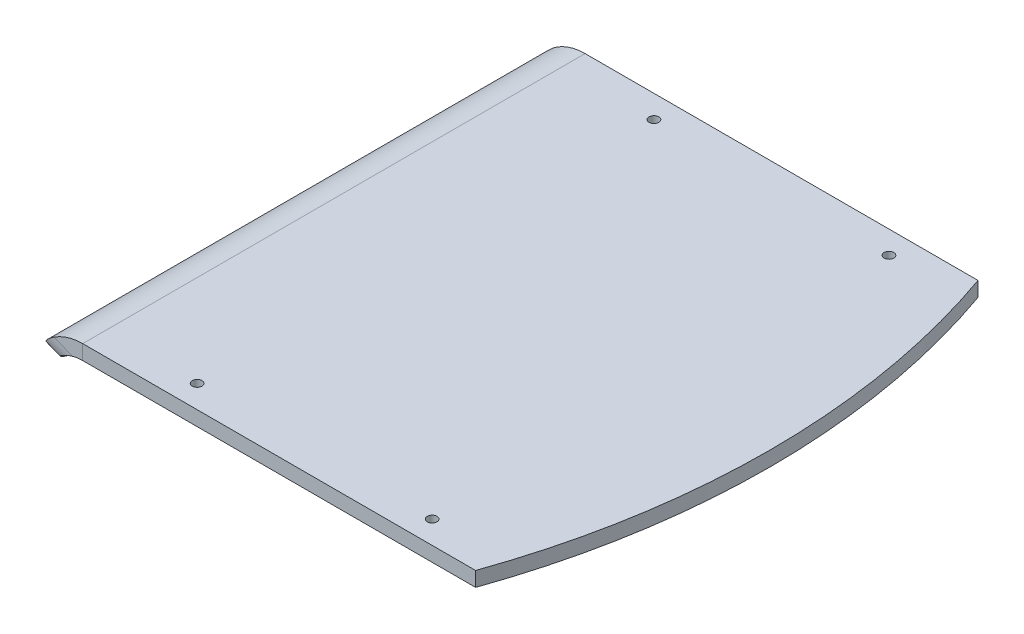
ISO-10303-21;
HEADER;
FILE_DESCRIPTION(('STEP AP214'),'2;1');
FILE_NAME('part.step','',(''),(''),'','','');
FILE_SCHEMA(('AUTOMOTIVE_DESIGN { 1 0 10303 214 1 1 1 1 }'));
ENDSEC;
DATA;
#1=APPLICATION_CONTEXT('core data for automotive mechanical design processes');
#2=APPLICATION_PROTOCOL_DEFINITION('international standard','automotive_design',2000,#1);
#3=PRODUCT_CONTEXT('',#1,'mechanical');
#4=PRODUCT('Part','Part','',(#3));
#5=PRODUCT_RELATED_PRODUCT_CATEGORY('part','',(#4));
#6=PRODUCT_DEFINITION_FORMATION('','',#4);
#7=PRODUCT_DEFINITION_CONTEXT('part definition',#1,'design');
#8=PRODUCT_DEFINITION('design','',#6,#7);
#9=PRODUCT_DEFINITION_SHAPE('','',#8);
#10=(LENGTH_UNIT() NAMED_UNIT(*) SI_UNIT(.MILLI.,.METRE.));
#11=(NAMED_UNIT(*) PLANE_ANGLE_UNIT() SI_UNIT($,.RADIAN.));
#12=(NAMED_UNIT(*) SI_UNIT($,.STERADIAN.) SOLID_ANGLE_UNIT());
#13=UNCERTAINTY_MEASURE_WITH_UNIT(LENGTH_MEASURE(1.E-05),#10,'distance_accuracy_value','');
#14=(GEOMETRIC_REPRESENTATION_CONTEXT(3) GLOBAL_UNCERTAINTY_ASSIGNED_CONTEXT((#13)) GLOBAL_UNIT_ASSIGNED_CONTEXT((#10,
#11,#12)) REPRESENTATION_CONTEXT('',''));
#15=CARTESIAN_POINT('',(0.,0.,0.));
#16=DIRECTION('',(0.,0.,1.));
#17=DIRECTION('',(1.,0.,0.));
#18=AXIS2_PLACEMENT_3D('',#15,#16,#17);
#19=CARTESIAN_POINT('',(150.,0.,171.));
#20=DIRECTION('',(0.,-1.,0.));
#21=DIRECTION('',(1.,0.,0.));
#22=AXIS2_PLACEMENT_3D('',#19,#20,#21);
#23=PLANE('',#22);
#24=CARTESIAN_POINT('',(75.6704769682475,0.,-155.5));
#25=DIRECTION('',(0.,-1.,0.));
#26=DIRECTION('',(1.,0.,0.));
#27=AXIS2_PLACEMENT_3D('',#24,#25,#26);
#28=CIRCLE('',#27,3.29999999999999);
#29=CARTESIAN_POINT('',(78.9704769682475,0.,-155.5));
#30=VERTEX_POINT('',#29);
#31=EDGE_CURVE('E251',#30,#30,#28,.T.);
#32=ORIENTED_EDGE('',*,*,#31,.F.);
#33=EDGE_LOOP('',(#32));
#34=FACE_BOUND('',#33,.T.);
#35=CARTESIAN_POINT('',(-84.3295230317525,0.,-155.5));
#36=DIRECTION('',(0.,-1.,0.));
#37=DIRECTION('',(1.,0.,0.));
#38=AXIS2_PLACEMENT_3D('',#35,#36,#37);
#39=CIRCLE('',#38,3.29999999999999);
#40=CARTESIAN_POINT('',(-81.0295230317525,0.,-155.5));
#41=VERTEX_POINT('',#40);
#42=EDGE_CURVE('E261',#41,#41,#39,.T.);
#43=ORIENTED_EDGE('',*,*,#42,.F.);
#44=EDGE_LOOP('',(#43));
#45=FACE_BOUND('',#44,.T.);
#46=CARTESIAN_POINT('',(-84.3295230317525,0.,155.5));
#47=DIRECTION('',(0.,-1.,0.));
#48=DIRECTION('',(1.,0.,0.));
#49=AXIS2_PLACEMENT_3D('',#46,#47,#48);
#50=CIRCLE('',#49,3.3);
#51=CARTESIAN_POINT('',(-81.0295230317525,0.,155.5));
#52=VERTEX_POINT('',#51);
#53=EDGE_CURVE('E267',#52,#52,#50,.T.);
#54=ORIENTED_EDGE('',*,*,#53,.F.);
#55=EDGE_LOOP('',(#54));
#56=FACE_BOUND('',#55,.T.);
#57=CARTESIAN_POINT('',(75.6704769682475,0.,155.5));
#58=DIRECTION('',(0.,-1.,0.));
#59=DIRECTION('',(1.,0.,0.));
#60=AXIS2_PLACEMENT_3D('',#57,#58,#59);
#61=CIRCLE('',#60,3.3);
#62=CARTESIAN_POINT('',(78.9704769682475,0.,155.5));
#63=VERTEX_POINT('',#62);
#64=EDGE_CURVE('E127',#63,#63,#61,.T.);
#65=ORIENTED_EDGE('',*,*,#64,.F.);
#66=EDGE_LOOP('',(#65));
#67=FACE_BOUND('',#66,.T.);
#68=CARTESIAN_POINT('',(-365.,0.,0.));
#69=DIRECTION('',(0.,-1.,0.));
#70=DIRECTION('',(1.,0.,0.));
#71=AXIS2_PLACEMENT_3D('',#68,#69,#70);
#72=CIRCLE('',#71,515.);
#73=CARTESIAN_POINT('',(120.781844041129,0.,-171.));
#74=VERTEX_POINT('',#73);
#75=CARTESIAN_POINT('',(120.781844041129,0.,171.));
#76=VERTEX_POINT('',#75);
#77=EDGE_CURVE('E110',#74,#76,#72,.T.);
#78=ORIENTED_EDGE('',*,*,#77,.T.);
#79=DIRECTION('',(-1.,0.,0.));
#80=VECTOR('',#79,1.);
#81=CARTESIAN_POINT('',(150.,0.,171.));
#82=LINE('',#81,#80);
#83=CARTESIAN_POINT('',(-146.676192420619,0.,171.));
#84=VERTEX_POINT('',#83);
#85=EDGE_CURVE('E114',#76,#84,#82,.T.);
#86=ORIENTED_EDGE('',*,*,#85,.T.);
#87=DIRECTION('',(0.,0.,-1.));
#88=VECTOR('',#87,1.);
#89=CARTESIAN_POINT('',(-146.676192420619,0.,171.));
#90=LINE('',#89,#88);
#91=CARTESIAN_POINT('',(-146.676192420619,0.,-171.));
#92=VERTEX_POINT('',#91);
#93=EDGE_CURVE('E153',#84,#92,#90,.T.);
#94=ORIENTED_EDGE('',*,*,#93,.T.);
#95=DIRECTION('',(-1.,0.,0.));
#96=VECTOR('',#95,1.);
#97=CARTESIAN_POINT('',(150.,0.,-171.));
#98=LINE('',#97,#96);
#99=EDGE_CURVE('E116',#74,#92,#98,.T.);
#100=ORIENTED_EDGE('',*,*,#99,.F.);
#101=EDGE_LOOP('',(#78,#86,#94,#100));
#102=FACE_BOUND('',#101,.T.);
#103=ADVANCED_FACE('F41',(#34,#45,#56,#67,#102),#23,.T.);
#104=CARTESIAN_POINT('',(150.,10.,171.));
#105=DIRECTION('',(0.,-1.,0.));
#106=DIRECTION('',(1.,0.,0.));
#107=AXIS2_PLACEMENT_3D('',#104,#105,#106);
#108=PLANE('',#107);
#109=CARTESIAN_POINT('',(75.6704769682475,9.99999999999999,-155.5));
#110=DIRECTION('',(0.,1.,0.));
#111=DIRECTION('',(1.,0.,0.));
#112=AXIS2_PLACEMENT_3D('',#109,#110,#111);
#113=CIRCLE('',#112,3.29999999999999);
#114=CARTESIAN_POINT('',(78.9704769682475,9.99999999999999,-155.5));
#115=VERTEX_POINT('',#114);
#116=EDGE_CURVE('E254',#115,#115,#113,.T.);
#117=ORIENTED_EDGE('',*,*,#116,.F.);
#118=EDGE_LOOP('',(#117));
#119=FACE_BOUND('',#118,.T.);
#120=CARTESIAN_POINT('',(-84.3295230317525,9.99999999999997,-155.5));
#121=DIRECTION('',(0.,1.,0.));
#122=DIRECTION('',(1.,0.,0.));
#123=AXIS2_PLACEMENT_3D('',#120,#121,#122);
#124=CIRCLE('',#123,3.29999999999999);
#125=CARTESIAN_POINT('',(-81.0295230317525,9.99999999999997,-155.5));
#126=VERTEX_POINT('',#125);
#127=EDGE_CURVE('E256',#126,#126,#124,.T.);
#128=ORIENTED_EDGE('',*,*,#127,.F.);
#129=EDGE_LOOP('',(#128));
#130=FACE_BOUND('',#129,.T.);
#131=CARTESIAN_POINT('',(-84.3295230317525,9.99999999999997,155.5));
#132=DIRECTION('',(0.,1.,0.));
#133=DIRECTION('',(-1.,0.,0.));
#134=AXIS2_PLACEMENT_3D('',#131,#132,#133);
#135=CIRCLE('',#134,3.3);
#136=CARTESIAN_POINT('',(-87.6295230317525,9.99999999999997,155.5));
#137=VERTEX_POINT('',#136);
#138=EDGE_CURVE('E264',#137,#137,#135,.T.);
#139=ORIENTED_EDGE('',*,*,#138,.F.);
#140=EDGE_LOOP('',(#139));
#141=FACE_BOUND('',#140,.T.);
#142=CARTESIAN_POINT('',(75.6704769682475,9.99999999999999,155.5));
#143=DIRECTION('',(0.,1.,0.));
#144=DIRECTION('',(-1.,0.,0.));
#145=AXIS2_PLACEMENT_3D('',#142,#143,#144);
#146=CIRCLE('',#145,3.3);
#147=CARTESIAN_POINT('',(72.3704769682475,9.99999999999999,155.5));
#148=VERTEX_POINT('',#147);
#149=EDGE_CURVE('E270',#148,#148,#146,.T.);
#150=ORIENTED_EDGE('',*,*,#149,.F.);
#151=EDGE_LOOP('',(#150));
#152=FACE_BOUND('',#151,.T.);
#153=DIRECTION('',(-1.,0.,0.));
#154=VECTOR('',#153,1.);
#155=CARTESIAN_POINT('',(150.,10.,171.));
#156=LINE('',#155,#154);
#157=CARTESIAN_POINT('',(120.781844041129,10.,171.));
#158=VERTEX_POINT('',#157);
#159=CARTESIAN_POINT('',(-146.676192420619,9.99999999999997,171.));
#160=VERTEX_POINT('',#159);
#161=EDGE_CURVE('E133',#158,#160,#156,.T.);
#162=ORIENTED_EDGE('',*,*,#161,.F.);
#163=CARTESIAN_POINT('',(-365.,9.99999999999994,0.));
#164=DIRECTION('',(0.,-1.,0.));
#165=DIRECTION('',(1.,0.,0.));
#166=AXIS2_PLACEMENT_3D('',#163,#164,#165);
#167=CIRCLE('',#166,515.);
#168=CARTESIAN_POINT('',(120.781844041129,10.,-171.));
#169=VERTEX_POINT('',#168);
#170=EDGE_CURVE('E119',#169,#158,#167,.T.);
#171=ORIENTED_EDGE('',*,*,#170,.F.);
#172=DIRECTION('',(-1.,0.,0.));
#173=VECTOR('',#172,1.);
#174=CARTESIAN_POINT('',(150.,10.,-171.));
#175=LINE('',#174,#173);
#176=CARTESIAN_POINT('',(-146.676192420619,9.99999999999997,-171.));
#177=VERTEX_POINT('',#176);
#178=EDGE_CURVE('E149',#169,#177,#175,.T.);
#179=ORIENTED_EDGE('',*,*,#178,.T.);
#180=DIRECTION('',(0.,0.,-1.));
#181=VECTOR('',#180,1.);
#182=CARTESIAN_POINT('',(-146.676192420619,9.99999999999997,171.));
#183=LINE('',#182,#181);
#184=EDGE_CURVE('E136',#160,#177,#183,.T.);
#185=ORIENTED_EDGE('',*,*,#184,.F.);
#186=EDGE_LOOP('',(#162,#171,#179,#185));
#187=FACE_BOUND('',#186,.T.);
#188=ADVANCED_FACE('F219',(#119,#130,#141,#152,#187),#108,.F.);
#189=CARTESIAN_POINT('',(-146.676192420619,-25.,171.));
#190=DIRECTION('',(0.,0.,1.));
#191=DIRECTION('',(1.,0.,0.));
#192=AXIS2_PLACEMENT_3D('',#189,#190,#191);
#193=PLANE('',#192);
#194=ORIENTED_EDGE('',*,*,#85,.F.);
#195=DIRECTION('',(0.,-1.,0.));
#196=VECTOR('',#195,1.);
#197=CARTESIAN_POINT('',(120.781844041129,0.,171.));
#198=LINE('',#197,#196);
#199=EDGE_CURVE('E120',#76,#158,#198,.F.);
#200=ORIENTED_EDGE('',*,*,#199,.T.);
#201=ORIENTED_EDGE('',*,*,#161,.T.);
#202=DIRECTION('',(0.,-1.,0.));
#203=VECTOR('',#202,1.);
#204=CARTESIAN_POINT('',(-146.676192420619,9.99999999999997,171.));
#205=LINE('',#204,#203);
#206=EDGE_CURVE('E131',#160,#84,#205,.T.);
#207=ORIENTED_EDGE('',*,*,#206,.T.);
#208=EDGE_LOOP('',(#194,#200,#201,#207));
#209=FACE_BOUND('',#208,.T.);
#210=ADVANCED_FACE('F129',(#209),#193,.T.);
#211=CARTESIAN_POINT('',(-146.676192420619,-25.,-171.));
#212=DIRECTION('',(0.,0.,1.));
#213=DIRECTION('',(1.,0.,0.));
#214=AXIS2_PLACEMENT_3D('',#211,#212,#213);
#215=PLANE('',#214);
#216=DIRECTION('',(0.,-1.,0.));
#217=VECTOR('',#216,1.);
#218=CARTESIAN_POINT('',(120.781844041129,0.,-171.));
#219=LINE('',#218,#217);
#220=EDGE_CURVE('E146',#74,#169,#219,.F.);
#221=ORIENTED_EDGE('',*,*,#220,.F.);
#222=ORIENTED_EDGE('',*,*,#99,.T.);
#223=DIRECTION('',(0.,1.,0.));
#224=VECTOR('',#223,1.);
#225=CARTESIAN_POINT('',(-146.676192420619,0.,-171.));
#226=LINE('',#225,#224);
#227=EDGE_CURVE('E160',#92,#177,#226,.T.);
#228=ORIENTED_EDGE('',*,*,#227,.T.);
#229=ORIENTED_EDGE('',*,*,#178,.F.);
#230=EDGE_LOOP('',(#221,#222,#228,#229));
#231=FACE_BOUND('',#230,.T.);
#232=ADVANCED_FACE('F197',(#231),#215,.F.);
#233=CARTESIAN_POINT('',(-146.676192420619,9.99999999999997,171.));
#234=DIRECTION('',(0.,0.,1.));
#235=DIRECTION('',(1.,0.,0.));
#236=AXIS2_PLACEMENT_3D('',#233,#234,#235);
#237=PLANE('',#236);
#238=CARTESIAN_POINT('',(-146.676192420619,-25.,171.));
#239=DIRECTION('',(0.,0.,1.));
#240=DIRECTION('',(1.,0.,0.));
#241=AXIS2_PLACEMENT_3D('',#238,#239,#240);
#242=CIRCLE('',#241,35.);
#243=CARTESIAN_POINT('',(-166.27320717973,3.99925882727339,171.));
#244=VERTEX_POINT('',#243);
#245=EDGE_CURVE('E138',#160,#244,#242,.T.);
#246=ORIENTED_EDGE('',*,*,#245,.T.);
#247=DIRECTION('',(-0.932952303175248,0.36,0.));
#248=VECTOR('',#247,1.);
#249=CARTESIAN_POINT('',(-151.231391440627,-1.80495393649508,171.));
#250=LINE('',#249,#248);
#251=CARTESIAN_POINT('',(-153.470476968248,-0.940953936495067,171.));
#252=VERTEX_POINT('',#251);
#253=EDGE_CURVE('E65',#244,#252,#250,.F.);
#254=ORIENTED_EDGE('',*,*,#253,.T.);
#255=CARTESIAN_POINT('',(-146.676192420619,-25.,171.));
#256=DIRECTION('',(0.,0.,1.));
#257=DIRECTION('',(1.,0.,0.));
#258=AXIS2_PLACEMENT_3D('',#255,#256,#257);
#259=CIRCLE('',#258,25.);
#260=EDGE_CURVE('E134',#84,#252,#259,.T.);
#261=ORIENTED_EDGE('',*,*,#260,.F.);
#262=ORIENTED_EDGE('',*,*,#206,.F.);
#263=EDGE_LOOP('',(#246,#254,#261,#262));
#264=FACE_BOUND('',#263,.T.);
#265=ADVANCED_FACE('F194',(#264),#237,.T.);
#266=CARTESIAN_POINT('',(-146.676192420619,0.,-171.));
#267=DIRECTION('',(0.,0.,-1.));
#268=DIRECTION('',(-1.,0.,0.));
#269=AXIS2_PLACEMENT_3D('',#266,#267,#268);
#270=PLANE('',#269);
#271=CARTESIAN_POINT('',(-146.676192420619,-25.,-171.));
#272=DIRECTION('',(0.,0.,1.));
#273=DIRECTION('',(1.,0.,0.));
#274=AXIS2_PLACEMENT_3D('',#271,#272,#273);
#275=CIRCLE('',#274,25.);
#276=CARTESIAN_POINT('',(-153.470476968248,-0.940953936495074,-171.));
#277=VERTEX_POINT('',#276);
#278=EDGE_CURVE('E145',#92,#277,#275,.T.);
#279=ORIENTED_EDGE('',*,*,#278,.T.);
#280=DIRECTION('',(-0.932952303175248,0.36,0.));
#281=VECTOR('',#280,1.);
#282=CARTESIAN_POINT('',(-147.872763149196,-3.10095393649508,-171.));
#283=LINE('',#282,#281);
#284=CARTESIAN_POINT('',(-166.27320717973,3.99925882727339,-171.));
#285=VERTEX_POINT('',#284);
#286=EDGE_CURVE('E12',#277,#285,#283,.T.);
#287=ORIENTED_EDGE('',*,*,#286,.T.);
#288=CARTESIAN_POINT('',(-146.676192420619,-25.,-171.));
#289=DIRECTION('',(0.,0.,1.));
#290=DIRECTION('',(1.,0.,0.));
#291=AXIS2_PLACEMENT_3D('',#288,#289,#290);
#292=CIRCLE('',#291,35.);
#293=EDGE_CURVE('E142',#177,#285,#292,.T.);
#294=ORIENTED_EDGE('',*,*,#293,.F.);
#295=ORIENTED_EDGE('',*,*,#227,.F.);
#296=EDGE_LOOP('',(#279,#287,#294,#295));
#297=FACE_BOUND('',#296,.T.);
#298=ADVANCED_FACE('F188',(#297),#270,.T.);
#299=CARTESIAN_POINT('',(-146.676192420619,-25.,171.));
#300=DIRECTION('',(0.,0.,-1.));
#301=DIRECTION('',(-1.,0.,0.));
#302=AXIS2_PLACEMENT_3D('',#299,#300,#301);
#303=CYLINDRICAL_SURFACE('',#302,35.);
#304=DIRECTION('',(0.,0.,-1.));
#305=VECTOR('',#304,1.);
#306=CARTESIAN_POINT('',(-179.329523031752,-12.4,171.));
#307=LINE('',#306,#305);
#308=CARTESIAN_POINT('',(-179.329523031752,-12.4,151.));
#309=VERTEX_POINT('',#308);
#310=CARTESIAN_POINT('',(-179.329523031752,-12.4,-151.));
#311=VERTEX_POINT('',#310);
#312=EDGE_CURVE('E157',#309,#311,#307,.T.);
#313=ORIENTED_EDGE('',*,*,#312,.F.);
#314=CARTESIAN_POINT('',(-179.329523031752,-12.4,151.));
#315=CARTESIAN_POINT('',(-179.32951869244,-12.4000020436537,151.280369808715));
#316=CARTESIAN_POINT('',(-179.327400926701,-12.3944988807085,151.56070865238));
#317=CARTESIAN_POINT('',(-179.318906284821,-12.3725127607563,152.120883935752));
#318=CARTESIAN_POINT('',(-179.312529512865,-12.3560300723359,152.400720387579));
#319=CARTESIAN_POINT('',(-179.286966293195,-12.2901689162072,153.238700231588));
#320=CARTESIAN_POINT('',(-179.261346970476,-12.2243773276892,153.795450848931));
#321=CARTESIAN_POINT('',(-179.192352661728,-12.0497832789324,154.900962671612));
#322=CARTESIAN_POINT('',(-179.148980472292,-11.9409875931814,155.449725121225));
#323=CARTESIAN_POINT('',(-179.069880491235,-11.7465560863308,156.263875147102));
#324=CARTESIAN_POINT('',(-179.041172172018,-11.6765359561089,156.533769768635));
#325=CARTESIAN_POINT('',(-178.978902833843,-11.5262655190938,157.070207546495));
#326=CARTESIAN_POINT('',(-178.945340530228,-11.4460125047294,157.33674979522));
#327=CARTESIAN_POINT('',(-178.837089129756,-11.1901782859639,158.130788257089));
#328=CARTESIAN_POINT('',(-178.754852983918,-10.9995656287208,158.652513665146));
#329=CARTESIAN_POINT('',(-178.568697630136,-10.580547852359,159.676559438595));
#330=CARTESIAN_POINT('',(-178.464778864271,-10.3521435037793,160.178880199373));
#331=CARTESIAN_POINT('',(-178.291338131235,-9.98331025520624,160.914951252148));
#332=CARTESIAN_POINT('',(-178.230588642447,-9.85597691530751,161.157436219876));
#333=CARTESIAN_POINT('',(-178.103013054542,-9.59297853026256,161.636122853834));
#334=CARTESIAN_POINT('',(-178.036188502992,-9.45731560984503,161.872326100568));
#335=CARTESIAN_POINT('',(-177.826215585233,-9.038368641247,162.570963975943));
#336=CARTESIAN_POINT('',(-177.673553462976,-8.74309511023661,163.02348898082));
#337=CARTESIAN_POINT('',(-177.343351341326,-8.12856353861602,163.892504502915));
#338=CARTESIAN_POINT('',(-177.16616812356,-7.80967551447046,164.309393319873));
#339=CARTESIAN_POINT('',(-176.783866849392,-7.14856655981326,165.110648942881));
#340=CARTESIAN_POINT('',(-176.578748967348,-6.80634577494399,165.495015951897));
#341=CARTESIAN_POINT('',(-176.139603556273,-6.10346844225158,166.227940622912));
#342=CARTESIAN_POINT('',(-175.90560483614,-5.74283047297241,166.576533344277));
#343=CARTESIAN_POINT('',(-175.407831479667,-5.00775536586026,167.235844086764));
#344=CARTESIAN_POINT('',(-175.144058596672,-4.63331904146052,167.546564335887));
#345=CARTESIAN_POINT('',(-174.601294200762,-3.8958023117067,168.112913241007));
#346=CARTESIAN_POINT('',(-174.323831092861,-3.53315932691876,168.370579039491));
#347=CARTESIAN_POINT('',(-173.74255271305,-2.8047482209068,168.849128068974));
#348=CARTESIAN_POINT('',(-173.438738033707,-2.43898017012265,169.070012126756));
#349=CARTESIAN_POINT('',(-172.805301238202,-1.70828935463149,169.47486886553));
#350=CARTESIAN_POINT('',(-172.475642056149,-1.34336860637391,169.658787132863));
#351=CARTESIAN_POINT('',(-171.792427012406,-0.6192178530618,169.989559454259));
#352=CARTESIAN_POINT('',(-171.438872352169,-0.259987563013157,170.136415370045));
#353=CARTESIAN_POINT('',(-170.711558440014,0.447144462933259,170.393357706261));
#354=CARTESIAN_POINT('',(-170.337908332545,0.795093626637897,170.503623235437));
#355=CARTESIAN_POINT('',(-169.570865536777,1.47825178670368,170.689893312308));
#356=CARTESIAN_POINT('',(-169.177468771967,1.81345812712171,170.765890753085));
#357=CARTESIAN_POINT('',(-168.374048817934,2.46763126574353,170.885425564772));
#358=CARTESIAN_POINT('',(-167.964062423522,2.78663080588718,170.929031020612));
#359=CARTESIAN_POINT('',(-167.337935430314,3.25172611100865,170.971994813317));
#360=CARTESIAN_POINT('',(-167.127414735605,3.40449264646199,170.982575480827));
#361=CARTESIAN_POINT('',(-166.702878724278,3.70539190832186,170.996577544341));
#362=CARTESIAN_POINT('',(-166.488863711114,3.8535250338813,170.99999955872));
#363=CARTESIAN_POINT('',(-166.27320717973,3.99925882727338,171.));
#364=B_SPLINE_CURVE_WITH_KNOTS('',3,(#314,#315,#316,#317,#318,#319,#320,#321,#322,#323,#324,
#325,#326,#327,#328,#329,#330,#331,#332,#333,#334,#335,#336,#337,#338,#339,#340,#341,#342,#343,
#344,#345,#346,#347,#348,#349,#350,#351,#352,#353,#354,#355,#356,#357,#358,#359,#360,#361,#362,
#363),.UNSPECIFIED.,.F.,.F.,(4,2,2,2,2,2,2,2,2,2,2,2,2,2,2,2,2,2,2,2,2,2,2,2,4),(0.,
0.840985613107881,1.68195065437118,3.36347185175469,5.04472826256047,5.8854212241463,
6.7263370923848,8.40873246986899,10.091093549038,10.9324874125462,11.7736675359072,
13.4558150533514,15.1156538775732,16.7754823420812,18.433668294762,20.0917566508425,
21.6627025585931,23.2336131497092,24.8068194541431,26.3799467172812,27.9452559020689,
29.5108895698512,31.073223037175,31.8540559339518,32.6348213782575),.UNSPECIFIED.);
#365=EDGE_CURVE('E176',#309,#244,#364,.T.);
#366=ORIENTED_EDGE('',*,*,#365,.T.);
#367=ORIENTED_EDGE('',*,*,#245,.F.);
#368=ORIENTED_EDGE('',*,*,#184,.T.);
#369=ORIENTED_EDGE('',*,*,#293,.T.);
#370=CARTESIAN_POINT('',(-166.27320717973,3.99925882727337,-171.));
#371=CARTESIAN_POINT('',(-166.502988858552,3.84398011202565,-170.999999416559));
#372=CARTESIAN_POINT('',(-166.730905905343,3.68597747730789,-170.996114422901));
#373=CARTESIAN_POINT('',(-167.182756288089,3.36472610782587,-170.980195034698));
#374=CARTESIAN_POINT('',(-167.406689206366,3.20147682800168,-170.968159790822));
#375=CARTESIAN_POINT('',(-168.072289027046,2.70403900246979,-170.919241922258));
#376=CARTESIAN_POINT('',(-168.507517767454,2.36232219131102,-170.869546366828));
#377=CARTESIAN_POINT('',(-169.358779749725,1.66092817290793,-170.733128188115));
#378=CARTESIAN_POINT('',(-169.774770360237,1.30121444050135,-170.646327324391));
#379=CARTESIAN_POINT('',(-170.583817718648,0.568013982951968,-170.433422762388));
#380=CARTESIAN_POINT('',(-170.976880420234,0.194530874781527,-170.307329321627));
#381=CARTESIAN_POINT('',(-171.739557422882,-0.5639931145575,-170.013446971183));
#382=CARTESIAN_POINT('',(-172.109045040831,-0.949082337281606,-169.84545330589));
#383=CARTESIAN_POINT('',(-172.820283603864,-1.72419299365009,-169.467186087466));
#384=CARTESIAN_POINT('',(-173.162032091388,-2.11421486077396,-169.256908793925));
#385=CARTESIAN_POINT('',(-173.815493796142,-2.89307185625862,-168.79452561891));
#386=CARTESIAN_POINT('',(-174.127264391368,-3.28190781442978,-168.542502264314));
#387=CARTESIAN_POINT('',(-174.720563800312,-4.05363663583609,-167.997203337866));
#388=CARTESIAN_POINT('',(-175.002094934095,-4.43652995307791,-167.703930934761));
#389=CARTESIAN_POINT('',(-175.514878438797,-5.16283912759188,-167.101084037074));
#390=CARTESIAN_POINT('',(-175.748312869798,-5.50707328784922,-166.794343618923));
#391=CARTESIAN_POINT('',(-176.189416304035,-6.18160424169637,-166.148740648587));
#392=CARTESIAN_POINT('',(-176.397086521795,-6.51190169177764,-165.809879611897));
#393=CARTESIAN_POINT('',(-176.787551156247,-7.15489695438989,-165.10195206277));
#394=CARTESIAN_POINT('',(-176.970328052417,-7.46758228123563,-164.732864565805));
#395=CARTESIAN_POINT('',(-177.31192202557,-8.07154828340603,-163.967121947117));
#396=CARTESIAN_POINT('',(-177.470738368981,-8.36282830324869,-163.570465981904));
#397=CARTESIAN_POINT('',(-177.768056466827,-8.92521234969637,-162.745710481692));
#398=CARTESIAN_POINT('',(-177.906195092182,-9.19592196648304,-162.317211289783));
#399=CARTESIAN_POINT('',(-178.160578300296,-9.70897442134124,-161.437354208368));
#400=CARTESIAN_POINT('',(-178.27682280769,-9.95131716176653,-160.985996240184));
#401=CARTESIAN_POINT('',(-178.488947345519,-10.4050905578868,-160.063331366091));
#402=CARTESIAN_POINT('',(-178.584824241537,-10.6165164541636,-159.592021403092));
#403=CARTESIAN_POINT('',(-178.757651929534,-11.0062354120001,-158.632459057027));
#404=CARTESIAN_POINT('',(-178.83460191733,-11.1845270656435,-158.144205955071));
#405=CARTESIAN_POINT('',(-178.939358357206,-11.431769232289,-157.382883761487));
#406=CARTESIAN_POINT('',(-178.973441907764,-11.5131732521121,-157.114643380726));
#407=CARTESIAN_POINT('',(-179.036676216058,-11.6656126298674,-156.57472751987));
#408=CARTESIAN_POINT('',(-179.065828125951,-11.7366504090808,-156.303052858094));
#409=CARTESIAN_POINT('',(-179.146150277662,-11.9339295504219,-155.483436256186));
#410=CARTESIAN_POINT('',(-179.190188918965,-12.0443414505104,-154.930887144463));
#411=CARTESIAN_POINT('',(-179.260268434532,-12.2216158195357,-153.817265289338));
#412=CARTESIAN_POINT('',(-179.286294851424,-12.2884433033057,-153.256186067565));
#413=CARTESIAN_POINT('',(-179.312262307432,-12.3553397945878,-152.411662795637));
#414=CARTESIAN_POINT('',(-179.318739425509,-12.3720811751213,-152.129644633648));
#415=CARTESIAN_POINT('',(-179.327367596153,-12.3944124529012,-151.565094892517));
#416=CARTESIAN_POINT('',(-179.329518554156,-12.4000021063867,-151.282563302287));
#417=CARTESIAN_POINT('',(-179.329523031752,-12.4,-151.));
#418=B_SPLINE_CURVE_WITH_KNOTS('',3,(#370,#371,#372,#373,#374,#375,#376,#377,#378,#379,#380,
#381,#382,#383,#384,#385,#386,#387,#388,#389,#390,#391,#392,#393,#394,#395,#396,#397,#398,#399,
#400,#401,#402,#403,#404,#405,#406,#407,#408,#409,#410,#411,#412,#413,#414,#415,#416,#417),
.UNSPECIFIED.,.F.,.F.,(4,2,2,2,2,2,2,2,2,2,2,2,2,2,2,2,2,2,2,2,2,2,2,4),(0.,0.831892906768225,
1.66387251781485,3.32869573056287,4.99704684953681,6.66496280167206,8.34119484703247,
10.0175752371821,11.6906803355784,13.3636569763491,14.9122246616339,16.4607193197145,
18.0102982749708,19.559924662305,21.134188689195,22.7084581349549,24.2829696732361,
25.8575480992361,26.704477633624,27.5512090298024,29.244625675799,30.9393999580739,
31.7869445698063,32.6345077074553),.UNSPECIFIED.);
#419=EDGE_CURVE('E169',#285,#311,#418,.T.);
#420=ORIENTED_EDGE('',*,*,#419,.T.);
#421=EDGE_LOOP('',(#313,#366,#367,#368,#369,#420));
#422=FACE_BOUND('',#421,.T.);
#423=ADVANCED_FACE('F182',(#422),#303,.T.);
#424=CARTESIAN_POINT('',(-170.,-16.,171.));
#425=DIRECTION('',(-0.36,-0.932952303175248,0.));
#426=DIRECTION('',(0.932952303175248,-0.36,0.));
#427=AXIS2_PLACEMENT_3D('',#424,#425,#426);
#428=PLANE('',#427);
#429=DIRECTION('',(0.,0.,-1.));
#430=VECTOR('',#429,1.);
#431=CARTESIAN_POINT('',(-170.,-16.,171.));
#432=LINE('',#431,#430);
#433=CARTESIAN_POINT('',(-170.,-16.,151.));
#434=VERTEX_POINT('',#433);
#435=CARTESIAN_POINT('',(-170.,-16.,-151.));
#436=VERTEX_POINT('',#435);
#437=EDGE_CURVE('E155',#434,#436,#432,.T.);
#438=ORIENTED_EDGE('',*,*,#437,.F.);
#439=DIRECTION('',(-0.932952303175248,0.36,0.));
#440=VECTOR('',#439,1.);
#441=CARTESIAN_POINT('',(-170.,-16.,151.));
#442=LINE('',#441,#440);
#443=EDGE_CURVE('E166',#434,#309,#442,.T.);
#444=ORIENTED_EDGE('',*,*,#443,.T.);
#445=ORIENTED_EDGE('',*,*,#312,.T.);
#446=DIRECTION('',(-0.932952303175248,0.36,0.));
#447=VECTOR('',#446,1.);
#448=CARTESIAN_POINT('',(-170.,-16.,-151.));
#449=LINE('',#448,#447);
#450=EDGE_CURVE('E164',#311,#436,#449,.F.);
#451=ORIENTED_EDGE('',*,*,#450,.T.);
#452=EDGE_LOOP('',(#438,#444,#445,#451));
#453=FACE_BOUND('',#452,.T.);
#454=ADVANCED_FACE('F187',(#453),#428,.T.);
#455=CARTESIAN_POINT('',(-146.676192420619,-25.,171.));
#456=DIRECTION('',(0.,0.,-1.));
#457=DIRECTION('',(-1.,0.,0.));
#458=AXIS2_PLACEMENT_3D('',#455,#456,#457);
#459=CYLINDRICAL_SURFACE('',#458,25.);
#460=ORIENTED_EDGE('',*,*,#260,.T.);
#461=CARTESIAN_POINT('',(-153.470476968248,-0.940953936495073,171.));
#462=CARTESIAN_POINT('',(-153.734646055077,-1.01555480021201,170.999997777231));
#463=CARTESIAN_POINT('',(-153.997566462623,-1.09450302131711,170.997965319418));
#464=CARTESIAN_POINT('',(-154.520620512828,-1.26099629256408,170.989290435364));
#465=CARTESIAN_POINT('',(-154.780753884676,-1.3485421698724,170.98264756519));
#466=CARTESIAN_POINT('',(-155.556810409444,-1.62402984213065,170.954967054939));
#467=CARTESIAN_POINT('',(-156.06803440286,-1.82472122928859,170.926176038072));
#468=CARTESIAN_POINT('',(-157.077210756007,-2.25967478214526,170.843284132359));
#469=CARTESIAN_POINT('',(-157.575075833261,-2.49411356008411,170.789046468465));
#470=CARTESIAN_POINT('',(-158.550950890503,-2.99340239909393,170.650839549178));
#471=CARTESIAN_POINT('',(-159.028966536213,-3.25824369983541,170.566878843868));
#472=CARTESIAN_POINT('',(-159.964622468309,-3.81707037518495,170.364489188251));
#473=CARTESIAN_POINT('',(-160.422104056383,-4.11123981900816,170.245832167188));
#474=CARTESIAN_POINT('',(-161.309399024532,-4.72292910794302,169.970744857913));
#475=CARTESIAN_POINT('',(-161.739210198483,-5.04045081058532,169.814311562562));
#476=CARTESIAN_POINT('',(-162.566040301978,-5.69225859072354,169.461723368197));
#477=CARTESIAN_POINT('',(-162.963171806385,-6.0264801416387,169.265713622443));
#478=CARTESIAN_POINT('',(-163.723399090995,-6.70648294881011,168.832212581218));
#479=CARTESIAN_POINT('',(-164.086499706766,-7.05226255324066,168.59472719294));
#480=CARTESIAN_POINT('',(-164.736110823747,-7.70761313650861,168.108514008297));
#481=CARTESIAN_POINT('',(-165.026607338574,-8.01666333431863,167.864388023614));
#482=CARTESIAN_POINT('',(-165.578929572967,-8.6336341057407,167.344399860973));
#483=CARTESIAN_POINT('',(-165.8407574897,-8.94155476417023,167.068540118424));
#484=CARTESIAN_POINT('',(-166.336049845424,-9.55187102757892,166.486059741885));
#485=CARTESIAN_POINT('',(-166.569482957589,-9.85426022308604,166.179405802506));
#486=CARTESIAN_POINT('',(-167.008331285613,-10.4486889225424,165.537381626778));
#487=CARTESIAN_POINT('',(-167.213745806987,-10.7407281698193,165.202010678968));
#488=CARTESIAN_POINT('',(-167.594129618366,-11.3049816320221,164.5112752147));
#489=CARTESIAN_POINT('',(-167.769598639002,-11.5774653244088,164.156405056302));
#490=CARTESIAN_POINT('',(-168.096187984069,-12.1050372843054,163.423341309079));
#491=CARTESIAN_POINT('',(-168.247308801807,-12.3601259041892,163.045148193006));
#492=CARTESIAN_POINT('',(-168.526927184762,-12.8498994459156,162.267720005319));
#493=CARTESIAN_POINT('',(-168.655421855932,-13.0845817557043,161.868482250419));
#494=CARTESIAN_POINT('',(-168.891565010891,-13.5308688194254,161.051387008981));
#495=CARTESIAN_POINT('',(-168.999212688289,-13.7424726805138,160.633528802947));
#496=CARTESIAN_POINT('',(-169.204505818903,-14.1586971244418,159.742242719744));
#497=CARTESIAN_POINT('',(-169.300310873486,-14.360870264092,159.267245697708));
#498=CARTESIAN_POINT('',(-169.471365225278,-14.7324805144039,158.300973882143));
#499=CARTESIAN_POINT('',(-169.546611757652,-14.9019132210352,157.809696909138));
#500=CARTESIAN_POINT('',(-169.678436073721,-15.2059076580481,156.814268685701));
#501=CARTESIAN_POINT('',(-169.735022256211,-15.3404850705002,156.310123337552));
#502=CARTESIAN_POINT('',(-169.831145099111,-15.5732291263236,155.292093443558));
#503=CARTESIAN_POINT('',(-169.870687056364,-15.6714070802417,154.778211975315));
#504=CARTESIAN_POINT('',(-169.935280690585,-15.8336029203277,153.721797132609));
#505=CARTESIAN_POINT('',(-169.959650069514,-15.8960034830993,153.178970110878));
#506=CARTESIAN_POINT('',(-169.983911374336,-15.9583931365921,152.362649422264));
#507=CARTESIAN_POINT('',(-169.989949757316,-15.9739877853176,152.090433022934));
#508=CARTESIAN_POINT('',(-169.997991675215,-15.9947931378005,151.545488574217));
#509=CARTESIAN_POINT('',(-169.999994387348,-16.0000017240611,151.272760431838));
#510=CARTESIAN_POINT('',(-170.,-16.,151.));
#511=B_SPLINE_CURVE_WITH_KNOTS('',3,(#461,#462,#463,#464,#465,#466,#467,#468,#469,#470,#471,
#472,#473,#474,#475,#476,#477,#478,#479,#480,#481,#482,#483,#484,#485,#486,#487,#488,#489,#490,
#491,#492,#493,#494,#495,#496,#497,#498,#499,#500,#501,#502,#503,#504,#505,#506,#507,#508,#509,
#510),.UNSPECIFIED.,.F.,.F.,(4,2,2,2,2,2,2,2,2,2,2,2,2,2,2,2,2,2,2,2,2,2,2,2,4),(0.,
0.823411847275851,1.64690299141032,3.29499093940459,4.95204062052904,6.60861402421825,
8.27633131174469,9.94418139985006,11.6060219968726,13.2676260980248,14.733941018569,
16.2001434816593,17.6679491501764,19.1357911939389,20.5760402627152,22.016260147539,
23.4566641132194,24.8971237845534,26.4705432626331,28.0441742397691,29.6170959751412,
31.189528539907,32.8283521836602,33.6463451608777,34.4645048923896),.UNSPECIFIED.);
#512=EDGE_CURVE('E50',#252,#434,#511,.T.);
#513=ORIENTED_EDGE('',*,*,#512,.T.);
#514=ORIENTED_EDGE('',*,*,#437,.T.);
#515=CARTESIAN_POINT('',(-170.,-16.,-151.));
#516=CARTESIAN_POINT('',(-169.999993051591,-16.0000060149173,-151.27941777223));
#517=CARTESIAN_POINT('',(-169.997891767743,-15.9945370495049,-151.558832117118));
#518=CARTESIAN_POINT('',(-169.989450846682,-15.9726951793243,-152.117163162333));
#519=CARTESIAN_POINT('',(-169.98311131611,-15.9563225489093,-152.396079875003));
#520=CARTESIAN_POINT('',(-169.966144390407,-15.9127197939425,-152.95293350636));
#521=CARTESIAN_POINT('',(-169.9555170795,-15.885489882658,-153.230870444183));
#522=CARTESIAN_POINT('',(-169.929877112891,-15.8202749399832,-153.78525658131));
#523=CARTESIAN_POINT('',(-169.914864356653,-15.7822896620262,-154.061705746358));
#524=CARTESIAN_POINT('',(-169.863025574886,-15.6522883889713,-154.888598750061));
#525=CARTESIAN_POINT('',(-169.819409061226,-15.5442537341357,-155.436247977798));
#526=CARTESIAN_POINT('',(-169.739339539598,-15.3513744041633,-156.248686557834));
#527=CARTESIAN_POINT('',(-169.710207581869,-15.2819403181801,-156.518003167612));
#528=CARTESIAN_POINT('',(-169.646804022412,-15.1330062889459,-157.053316142971));
#529=CARTESIAN_POINT('',(-169.612531016242,-15.0535035960615,-157.319311579694));
#530=CARTESIAN_POINT('',(-169.501571395142,-14.8001850409948,-158.111848510376));
#531=CARTESIAN_POINT('',(-169.416772836421,-14.6116296424405,-158.632643045582));
#532=CARTESIAN_POINT('',(-169.223164553767,-14.1978634212989,-159.654850065631));
#533=CARTESIAN_POINT('',(-169.114355793419,-13.9726540698126,-160.15626332734));
#534=CARTESIAN_POINT('',(-168.931153496084,-13.6098727654225,-160.890808986379));
#535=CARTESIAN_POINT('',(-168.86676015411,-13.4847948377233,-161.132710898391));
#536=CARTESIAN_POINT('',(-168.73096158481,-13.2267925326384,-161.610194667454));
#537=CARTESIAN_POINT('',(-168.659558128185,-13.0938701400714,-161.845778101461));
#538=CARTESIAN_POINT('',(-168.434256782422,-12.6839990350414,-162.542458407517));
#539=CARTESIAN_POINT('',(-168.269249213714,-12.3959086166838,-162.993561469217));
#540=CARTESIAN_POINT('',(-167.911586067217,-11.8024651373118,-163.853845939266));
#541=CARTESIAN_POINT('',(-167.71974933016,-11.4977453866788,-164.263806422402));
#542=CARTESIAN_POINT('',(-167.30310738872,-10.8694521222116,-165.051328780408));
#543=CARTESIAN_POINT('',(-167.078302679469,-10.5458788915736,-165.428891141716));
#544=CARTESIAN_POINT('',(-166.594197610629,-9.88575472835528,-166.148283241964));
#545=CARTESIAN_POINT('',(-166.334924811249,-9.54921431526439,-166.490141143747));
#546=CARTESIAN_POINT('',(-165.78082124993,-8.8691165233785,-167.135949007106));
#547=CARTESIAN_POINT('',(-165.485994312818,-8.52555990266681,-167.439903039143));
#548=CARTESIAN_POINT('',(-164.890402294946,-7.87050474976379,-167.981344124146));
#549=CARTESIAN_POINT('',(-164.592829347347,-7.55904376209181,-168.222397642927));
#550=CARTESIAN_POINT('',(-163.969383708219,-6.94070275806398,-168.671478880613));
#551=CARTESIAN_POINT('',(-163.643512935328,-6.63382243278247,-168.87950883587));
#552=CARTESIAN_POINT('',(-162.964963917734,-6.02943501912963,-169.262734711502));
#553=CARTESIAN_POINT('',(-162.612287695545,-5.73192722597677,-169.437933105622));
#554=CARTESIAN_POINT('',(-161.882147321423,-5.1506506854278,-169.756503681618));
#555=CARTESIAN_POINT('',(-161.50468331786,-4.86688185581383,-169.899876053968));
#556=CARTESIAN_POINT('',(-160.740871309199,-4.32643968219342,-170.152064531658));
#557=CARTESIAN_POINT('',(-160.355281657263,-4.06916874695411,-170.261903997763));
#558=CARTESIAN_POINT('',(-159.565669521198,-3.57388043283482,-170.45559006503));
#559=CARTESIAN_POINT('',(-159.161646386493,-3.33586373432162,-170.539435747975));
#560=CARTESIAN_POINT('',(-158.337501983519,-2.88133357876327,-170.683606697095));
#561=CARTESIAN_POINT('',(-157.917375721678,-2.66482686795224,-170.743924601438));
#562=CARTESIAN_POINT('',(-157.063606813196,-2.25520239346485,-170.84370574655));
#563=CARTESIAN_POINT('',(-156.629966813505,-2.06208008521929,-170.883173044495));
#564=CARTESIAN_POINT('',(-155.746786312985,-1.69861376416869,-170.944431684503));
#565=CARTESIAN_POINT('',(-155.297127570924,-1.52852667320467,-170.966035521975));
#566=CARTESIAN_POINT('',(-154.389679063827,-1.21486888531321,-170.993793044909));
#567=CARTESIAN_POINT('',(-153.931917621219,-1.07122044693987,-170.999992719982));
#568=CARTESIAN_POINT('',(-153.470476968248,-0.940953936495073,-171.));
#569=B_SPLINE_CURVE_WITH_KNOTS('',3,(#515,#516,#517,#518,#519,#520,#521,#522,#523,#524,#525,
#526,#527,#528,#529,#530,#531,#532,#533,#534,#535,#536,#537,#538,#539,#540,#541,#542,#543,#544,
#545,#546,#547,#548,#549,#550,#551,#552,#553,#554,#555,#556,#557,#558,#559,#560,#561,#562,#563,
#564,#565,#566,#567,#568),.UNSPECIFIED.,.F.,.F.,(4,2,2,2,2,2,2,2,2,2,2,2,2,2,2,2,2,2,2,2,2,2,2,
2,2,2,4),(0.,0.838185194080161,1.6763492989237,2.51449694069583,3.35266379855524,
5.03001841560262,5.86875671069041,6.70772455252389,8.38657899313643,10.0653660697786,
10.904632876046,11.743688232657,13.4215386483837,15.0563007706039,16.6910383435508,
18.3244765775759,19.9577392468671,21.4367089198193,22.9155783943724,24.3943363963915,
25.8730855480059,27.3007087745981,28.7283824256006,30.1565024374206,31.5843444587074,
33.0269901706472,34.4653236152514),.UNSPECIFIED.);
#570=EDGE_CURVE('E57',#436,#277,#569,.T.);
#571=ORIENTED_EDGE('',*,*,#570,.T.);
#572=ORIENTED_EDGE('',*,*,#278,.F.);
#573=ORIENTED_EDGE('',*,*,#93,.F.);
#574=EDGE_LOOP('',(#460,#513,#514,#571,#572,#573));
#575=FACE_BOUND('',#574,.T.);
#576=ADVANCED_FACE('F212',(#575),#459,.F.);
#577=CARTESIAN_POINT('',(-365.,0.,0.));
#578=DIRECTION('',(0.,-1.,0.));
#579=DIRECTION('',(1.,0.,0.));
#580=AXIS2_PLACEMENT_3D('',#577,#578,#579);
#581=CYLINDRICAL_SURFACE('',#580,515.);
#582=ORIENTED_EDGE('',*,*,#170,.T.);
#583=ORIENTED_EDGE('',*,*,#199,.F.);
#584=ORIENTED_EDGE('',*,*,#77,.F.);
#585=ORIENTED_EDGE('',*,*,#220,.T.);
#586=EDGE_LOOP('',(#582,#583,#584,#585));
#587=FACE_BOUND('',#586,.T.);
#588=ADVANCED_FACE('F123',(#587),#581,.T.);
#589=CARTESIAN_POINT('',(-162.8,2.65904606350492,151.));
#590=DIRECTION('',(-0.932952303175248,0.36,0.));
#591=DIRECTION('',(-0.36,-0.932952303175248,0.));
#592=AXIS2_PLACEMENT_3D('',#589,#590,#591);
#593=CYLINDRICAL_SURFACE('',#592,20.);
#594=ORIENTED_EDGE('',*,*,#512,.F.);
#595=ORIENTED_EDGE('',*,*,#253,.F.);
#596=ORIENTED_EDGE('',*,*,#365,.F.);
#597=ORIENTED_EDGE('',*,*,#443,.F.);
#598=EDGE_LOOP('',(#594,#595,#596,#597));
#599=FACE_BOUND('',#598,.T.);
#600=ADVANCED_FACE('F198',(#599),#593,.T.);
#601=CARTESIAN_POINT('',(-147.872763149196,-3.10095393649508,-151.));
#602=DIRECTION('',(-0.932952303175248,0.36,0.));
#603=DIRECTION('',(-0.36,-0.932952303175248,0.));
#604=AXIS2_PLACEMENT_3D('',#601,#602,#603);
#605=CYLINDRICAL_SURFACE('',#604,20.);
#606=ORIENTED_EDGE('',*,*,#570,.F.);
#607=ORIENTED_EDGE('',*,*,#450,.F.);
#608=ORIENTED_EDGE('',*,*,#419,.F.);
#609=ORIENTED_EDGE('',*,*,#286,.F.);
#610=EDGE_LOOP('',(#606,#607,#608,#609));
#611=FACE_BOUND('',#610,.T.);
#612=ADVANCED_FACE('F43',(#611),#605,.T.);
#613=CARTESIAN_POINT('',(75.6704769682475,-17.2838097214914,155.5));
#614=DIRECTION('',(0.,1.,0.));
#615=DIRECTION('',(-1.,0.,0.));
#616=AXIS2_PLACEMENT_3D('',#613,#614,#615);
#617=CYLINDRICAL_SURFACE('',#616,3.3);
#618=ORIENTED_EDGE('',*,*,#64,.T.);
#619=EDGE_LOOP('',(#618));
#620=FACE_BOUND('',#619,.T.);
#621=ORIENTED_EDGE('',*,*,#149,.T.);
#622=EDGE_LOOP('',(#621));
#623=FACE_BOUND('',#622,.T.);
#624=ADVANCED_FACE('F231',(#620,#623),#617,.F.);
#625=CARTESIAN_POINT('',(-84.3295230317525,-17.2838097214915,155.5));
#626=DIRECTION('',(0.,1.,0.));
#627=DIRECTION('',(-1.,0.,0.));
#628=AXIS2_PLACEMENT_3D('',#625,#626,#627);
#629=CYLINDRICAL_SURFACE('',#628,3.3);
#630=ORIENTED_EDGE('',*,*,#53,.T.);
#631=EDGE_LOOP('',(#630));
#632=FACE_BOUND('',#631,.T.);
#633=ORIENTED_EDGE('',*,*,#138,.T.);
#634=EDGE_LOOP('',(#633));
#635=FACE_BOUND('',#634,.T.);
#636=ADVANCED_FACE('F234',(#632,#635),#629,.F.);
#637=CARTESIAN_POINT('',(-84.3295230317525,-17.2838097214915,-155.5));
#638=DIRECTION('',(0.,1.,0.));
#639=DIRECTION('',(-1.,0.,0.));
#640=AXIS2_PLACEMENT_3D('',#637,#638,#639);
#641=CYLINDRICAL_SURFACE('',#640,3.29999999999999);
#642=ORIENTED_EDGE('',*,*,#42,.T.);
#643=EDGE_LOOP('',(#642));
#644=FACE_BOUND('',#643,.T.);
#645=ORIENTED_EDGE('',*,*,#127,.T.);
#646=EDGE_LOOP('',(#645));
#647=FACE_BOUND('',#646,.T.);
#648=ADVANCED_FACE('F238',(#644,#647),#641,.F.);
#649=CARTESIAN_POINT('',(75.6704769682475,-17.2838097214914,-155.5));
#650=DIRECTION('',(0.,1.,0.));
#651=DIRECTION('',(-1.,0.,0.));
#652=AXIS2_PLACEMENT_3D('',#649,#650,#651);
#653=CYLINDRICAL_SURFACE('',#652,3.29999999999999);
#654=ORIENTED_EDGE('',*,*,#31,.T.);
#655=EDGE_LOOP('',(#654));
#656=FACE_BOUND('',#655,.T.);
#657=ORIENTED_EDGE('',*,*,#116,.T.);
#658=EDGE_LOOP('',(#657));
#659=FACE_BOUND('',#658,.T.);
#660=ADVANCED_FACE('F242',(#656,#659),#653,.F.);
#661=CLOSED_SHELL('',(#103,#188,#210,#232,#265,#298,#423,#454,#576,#588,#600,#612,#624,#636,
#648,#660));
#662=MANIFOLD_SOLID_BREP('B2',#661);
#663=ADVANCED_BREP_SHAPE_REPRESENTATION('',(#18,#662),#14);
#664=SHAPE_DEFINITION_REPRESENTATION(#9,#663);
ENDSEC;
END-ISO-10303-21;
